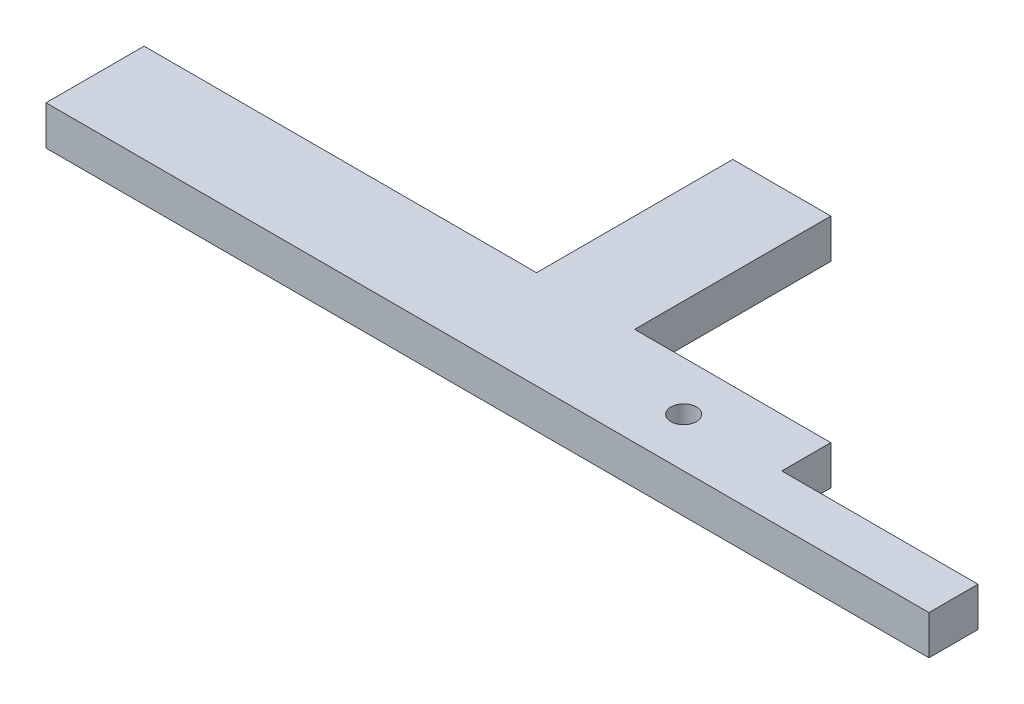
ISO-10303-21;
HEADER;
FILE_DESCRIPTION(('STEP AP214'),'2;1');
FILE_NAME('part.step','',(''),(''),'','','');
FILE_SCHEMA(('AUTOMOTIVE_DESIGN { 1 0 10303 214 1 1 1 1 }'));
ENDSEC;
DATA;
#1=APPLICATION_CONTEXT('core data for automotive mechanical design processes');
#2=APPLICATION_PROTOCOL_DEFINITION('international standard','automotive_design',2000,#1);
#3=PRODUCT_CONTEXT('',#1,'mechanical');
#4=PRODUCT('Part','Part','',(#3));
#5=PRODUCT_RELATED_PRODUCT_CATEGORY('part','',(#4));
#6=PRODUCT_DEFINITION_FORMATION('','',#4);
#7=PRODUCT_DEFINITION_CONTEXT('part definition',#1,'design');
#8=PRODUCT_DEFINITION('design','',#6,#7);
#9=PRODUCT_DEFINITION_SHAPE('','',#8);
#10=(LENGTH_UNIT() NAMED_UNIT(*) SI_UNIT(.MILLI.,.METRE.));
#11=(NAMED_UNIT(*) PLANE_ANGLE_UNIT() SI_UNIT($,.RADIAN.));
#12=(NAMED_UNIT(*) SI_UNIT($,.STERADIAN.) SOLID_ANGLE_UNIT());
#13=UNCERTAINTY_MEASURE_WITH_UNIT(LENGTH_MEASURE(1.E-05),#10,'distance_accuracy_value','');
#14=(GEOMETRIC_REPRESENTATION_CONTEXT(3) GLOBAL_UNCERTAINTY_ASSIGNED_CONTEXT((#13)) GLOBAL_UNIT_ASSIGNED_CONTEXT((#10,
#11,#12)) REPRESENTATION_CONTEXT('',''));
#15=CARTESIAN_POINT('',(0.,0.,0.));
#16=DIRECTION('',(0.,0.,1.));
#17=DIRECTION('',(1.,0.,0.));
#18=AXIS2_PLACEMENT_3D('',#15,#16,#17);
#19=CARTESIAN_POINT('',(0.,10.16,12.7));
#20=DIRECTION('',(0.,0.,-1.));
#21=DIRECTION('',(-1.,0.,0.));
#22=AXIS2_PLACEMENT_3D('',#19,#20,#21);
#23=PLANE('',#22);
#24=DIRECTION('',(1.,0.,0.));
#25=VECTOR('',#24,1.);
#26=CARTESIAN_POINT('',(0.,0.,12.7));
#27=LINE('',#26,#25);
#28=CARTESIAN_POINT('',(-152.4,0.,12.7));
#29=VERTEX_POINT('',#28);
#30=CARTESIAN_POINT('',(76.2,0.,12.7));
#31=VERTEX_POINT('',#30);
#32=EDGE_CURVE('E151',#29,#31,#27,.T.);
#33=ORIENTED_EDGE('',*,*,#32,.T.);
#34=DIRECTION('',(0.,-1.,0.));
#35=VECTOR('',#34,1.);
#36=CARTESIAN_POINT('',(76.2,10.16,12.7));
#37=LINE('',#36,#35);
#38=CARTESIAN_POINT('',(76.2,10.16,12.7));
#39=VERTEX_POINT('',#38);
#40=EDGE_CURVE('E11',#39,#31,#37,.T.);
#41=ORIENTED_EDGE('',*,*,#40,.F.);
#42=DIRECTION('',(1.,0.,0.));
#43=VECTOR('',#42,1.);
#44=CARTESIAN_POINT('',(0.,10.16,12.7));
#45=LINE('',#44,#43);
#46=CARTESIAN_POINT('',(-152.4,10.16,12.7));
#47=VERTEX_POINT('',#46);
#48=EDGE_CURVE('E211',#47,#39,#45,.T.);
#49=ORIENTED_EDGE('',*,*,#48,.F.);
#50=DIRECTION('',(0.,-1.,0.));
#51=VECTOR('',#50,1.);
#52=CARTESIAN_POINT('',(-152.4,10.16,12.7));
#53=LINE('',#52,#51);
#54=EDGE_CURVE('E144',#47,#29,#53,.T.);
#55=ORIENTED_EDGE('',*,*,#54,.T.);
#56=EDGE_LOOP('',(#33,#41,#49,#55));
#57=FACE_BOUND('',#56,.T.);
#58=ADVANCED_FACE('F41',(#57),#23,.F.);
#59=CARTESIAN_POINT('',(76.2,10.16,0.));
#60=DIRECTION('',(-1.,0.,0.));
#61=DIRECTION('',(0.,0.,1.));
#62=AXIS2_PLACEMENT_3D('',#59,#60,#61);
#63=PLANE('',#62);
#64=DIRECTION('',(0.,0.,-1.));
#65=VECTOR('',#64,1.);
#66=CARTESIAN_POINT('',(76.2,0.,0.));
#67=LINE('',#66,#65);
#68=CARTESIAN_POINT('',(76.2,0.,0.));
#69=VERTEX_POINT('',#68);
#70=EDGE_CURVE('E154',#31,#69,#67,.T.);
#71=ORIENTED_EDGE('',*,*,#70,.T.);
#72=DIRECTION('',(0.,-1.,0.));
#73=VECTOR('',#72,1.);
#74=CARTESIAN_POINT('',(76.2,10.16,0.));
#75=LINE('',#74,#73);
#76=CARTESIAN_POINT('',(76.2,10.16,0.));
#77=VERTEX_POINT('',#76);
#78=EDGE_CURVE('E50',#77,#69,#75,.T.);
#79=ORIENTED_EDGE('',*,*,#78,.F.);
#80=DIRECTION('',(0.,0.,-1.));
#81=VECTOR('',#80,1.);
#82=CARTESIAN_POINT('',(76.2,10.16,0.));
#83=LINE('',#82,#81);
#84=EDGE_CURVE('E103',#39,#77,#83,.T.);
#85=ORIENTED_EDGE('',*,*,#84,.F.);
#86=ORIENTED_EDGE('',*,*,#40,.T.);
#87=EDGE_LOOP('',(#71,#79,#85,#86));
#88=FACE_BOUND('',#87,.T.);
#89=ADVANCED_FACE('F193',(#88),#63,.F.);
#90=CARTESIAN_POINT('',(0.,10.16,0.));
#91=DIRECTION('',(0.,0.,-1.));
#92=DIRECTION('',(-1.,0.,0.));
#93=AXIS2_PLACEMENT_3D('',#90,#91,#92);
#94=PLANE('',#93);
#95=DIRECTION('',(1.,0.,0.));
#96=VECTOR('',#95,1.);
#97=CARTESIAN_POINT('',(0.,0.,0.));
#98=LINE('',#97,#96);
#99=CARTESIAN_POINT('',(25.4,0.,0.));
#100=VERTEX_POINT('',#99);
#101=EDGE_CURVE('E157',#100,#69,#98,.T.);
#102=ORIENTED_EDGE('',*,*,#101,.F.);
#103=DIRECTION('',(0.,-1.,0.));
#104=VECTOR('',#103,1.);
#105=CARTESIAN_POINT('',(25.4,10.16,0.));
#106=LINE('',#105,#104);
#107=CARTESIAN_POINT('',(25.4,10.16,0.));
#108=VERTEX_POINT('',#107);
#109=EDGE_CURVE('E186',#108,#100,#106,.T.);
#110=ORIENTED_EDGE('',*,*,#109,.F.);
#111=DIRECTION('',(1.,0.,0.));
#112=VECTOR('',#111,1.);
#113=CARTESIAN_POINT('',(0.,10.16,0.));
#114=LINE('',#113,#112);
#115=EDGE_CURVE('E192',#108,#77,#114,.T.);
#116=ORIENTED_EDGE('',*,*,#115,.T.);
#117=ORIENTED_EDGE('',*,*,#78,.T.);
#118=EDGE_LOOP('',(#102,#110,#116,#117));
#119=FACE_BOUND('',#118,.T.);
#120=ADVANCED_FACE('F190',(#119),#94,.T.);
#121=CARTESIAN_POINT('',(25.4,10.16,0.));
#122=DIRECTION('',(1.,0.,0.));
#123=DIRECTION('',(0.,0.,-1.));
#124=AXIS2_PLACEMENT_3D('',#121,#122,#123);
#125=PLANE('',#124);
#126=DIRECTION('',(0.,0.,1.));
#127=VECTOR('',#126,1.);
#128=CARTESIAN_POINT('',(25.4,0.,0.));
#129=LINE('',#128,#127);
#130=CARTESIAN_POINT('',(25.4,0.,-12.7));
#131=VERTEX_POINT('',#130);
#132=EDGE_CURVE('E160',#131,#100,#129,.T.);
#133=ORIENTED_EDGE('',*,*,#132,.F.);
#134=DIRECTION('',(0.,-1.,0.));
#135=VECTOR('',#134,1.);
#136=CARTESIAN_POINT('',(25.4,10.16,-12.7));
#137=LINE('',#136,#135);
#138=CARTESIAN_POINT('',(25.4,10.16,-12.7));
#139=VERTEX_POINT('',#138);
#140=EDGE_CURVE('E184',#139,#131,#137,.T.);
#141=ORIENTED_EDGE('',*,*,#140,.F.);
#142=DIRECTION('',(0.,0.,1.));
#143=VECTOR('',#142,1.);
#144=CARTESIAN_POINT('',(25.4,10.16,0.));
#145=LINE('',#144,#143);
#146=EDGE_CURVE('E205',#139,#108,#145,.T.);
#147=ORIENTED_EDGE('',*,*,#146,.T.);
#148=ORIENTED_EDGE('',*,*,#109,.T.);
#149=EDGE_LOOP('',(#133,#141,#147,#148));
#150=FACE_BOUND('',#149,.T.);
#151=ADVANCED_FACE('F202',(#150),#125,.T.);
#152=CARTESIAN_POINT('',(0.,10.16,-12.7));
#153=DIRECTION('',(0.,0.,-1.));
#154=DIRECTION('',(-1.,0.,0.));
#155=AXIS2_PLACEMENT_3D('',#152,#153,#154);
#156=PLANE('',#155);
#157=DIRECTION('',(1.,0.,0.));
#158=VECTOR('',#157,1.);
#159=CARTESIAN_POINT('',(0.,0.,-12.7));
#160=LINE('',#159,#158);
#161=CARTESIAN_POINT('',(-25.4,0.,-12.7));
#162=VERTEX_POINT('',#161);
#163=EDGE_CURVE('E163',#162,#131,#160,.T.);
#164=ORIENTED_EDGE('',*,*,#163,.F.);
#165=DIRECTION('',(0.,-1.,0.));
#166=VECTOR('',#165,1.);
#167=CARTESIAN_POINT('',(-25.4,10.16,-12.7));
#168=LINE('',#167,#166);
#169=CARTESIAN_POINT('',(-25.4,10.16,-12.7));
#170=VERTEX_POINT('',#169);
#171=EDGE_CURVE('E182',#170,#162,#168,.T.);
#172=ORIENTED_EDGE('',*,*,#171,.F.);
#173=DIRECTION('',(1.,0.,0.));
#174=VECTOR('',#173,1.);
#175=CARTESIAN_POINT('',(0.,10.16,-12.7));
#176=LINE('',#175,#174);
#177=EDGE_CURVE('E209',#170,#139,#176,.T.);
#178=ORIENTED_EDGE('',*,*,#177,.T.);
#179=ORIENTED_EDGE('',*,*,#140,.T.);
#180=EDGE_LOOP('',(#164,#172,#178,#179));
#181=FACE_BOUND('',#180,.T.);
#182=ADVANCED_FACE('F245',(#181),#156,.T.);
#183=CARTESIAN_POINT('',(-25.4,10.16,0.));
#184=DIRECTION('',(-1.,0.,0.));
#185=DIRECTION('',(0.,0.,1.));
#186=AXIS2_PLACEMENT_3D('',#183,#184,#185);
#187=PLANE('',#186);
#188=DIRECTION('',(0.,0.,-1.));
#189=VECTOR('',#188,1.);
#190=CARTESIAN_POINT('',(-25.4,0.,0.));
#191=LINE('',#190,#189);
#192=CARTESIAN_POINT('',(-25.4,0.,-63.5));
#193=VERTEX_POINT('',#192);
#194=EDGE_CURVE('E166',#162,#193,#191,.T.);
#195=ORIENTED_EDGE('',*,*,#194,.T.);
#196=DIRECTION('',(0.,-1.,0.));
#197=VECTOR('',#196,1.);
#198=CARTESIAN_POINT('',(-25.4,10.16,-63.5));
#199=LINE('',#198,#197);
#200=CARTESIAN_POINT('',(-25.4,10.16,-63.5));
#201=VERTEX_POINT('',#200);
#202=EDGE_CURVE('E180',#201,#193,#199,.T.);
#203=ORIENTED_EDGE('',*,*,#202,.F.);
#204=DIRECTION('',(0.,0.,-1.));
#205=VECTOR('',#204,1.);
#206=CARTESIAN_POINT('',(-25.4,10.16,0.));
#207=LINE('',#206,#205);
#208=EDGE_CURVE('E216',#170,#201,#207,.T.);
#209=ORIENTED_EDGE('',*,*,#208,.F.);
#210=ORIENTED_EDGE('',*,*,#171,.T.);
#211=EDGE_LOOP('',(#195,#203,#209,#210));
#212=FACE_BOUND('',#211,.T.);
#213=ADVANCED_FACE('F248',(#212),#187,.F.);
#214=CARTESIAN_POINT('',(0.,10.16,-63.5));
#215=DIRECTION('',(0.,0.,-1.));
#216=DIRECTION('',(-1.,0.,0.));
#217=AXIS2_PLACEMENT_3D('',#214,#215,#216);
#218=PLANE('',#217);
#219=DIRECTION('',(1.,0.,0.));
#220=VECTOR('',#219,1.);
#221=CARTESIAN_POINT('',(0.,0.,-63.5));
#222=LINE('',#221,#220);
#223=CARTESIAN_POINT('',(-50.8,0.,-63.5));
#224=VERTEX_POINT('',#223);
#225=EDGE_CURVE('E169',#224,#193,#222,.T.);
#226=ORIENTED_EDGE('',*,*,#225,.F.);
#227=DIRECTION('',(0.,-1.,0.));
#228=VECTOR('',#227,1.);
#229=CARTESIAN_POINT('',(-50.8,10.16,-63.5));
#230=LINE('',#229,#228);
#231=CARTESIAN_POINT('',(-50.8,10.16,-63.5));
#232=VERTEX_POINT('',#231);
#233=EDGE_CURVE('E134',#232,#224,#230,.T.);
#234=ORIENTED_EDGE('',*,*,#233,.F.);
#235=DIRECTION('',(1.,0.,0.));
#236=VECTOR('',#235,1.);
#237=CARTESIAN_POINT('',(0.,10.16,-63.5));
#238=LINE('',#237,#236);
#239=EDGE_CURVE('E140',#232,#201,#238,.T.);
#240=ORIENTED_EDGE('',*,*,#239,.T.);
#241=ORIENTED_EDGE('',*,*,#202,.T.);
#242=EDGE_LOOP('',(#226,#234,#240,#241));
#243=FACE_BOUND('',#242,.T.);
#244=ADVANCED_FACE('F219',(#243),#218,.T.);
#245=CARTESIAN_POINT('',(-50.8,10.16,0.));
#246=DIRECTION('',(-1.,0.,0.));
#247=DIRECTION('',(0.,0.,1.));
#248=AXIS2_PLACEMENT_3D('',#245,#246,#247);
#249=PLANE('',#248);
#250=DIRECTION('',(0.,0.,-1.));
#251=VECTOR('',#250,1.);
#252=CARTESIAN_POINT('',(-50.8,0.,0.));
#253=LINE('',#252,#251);
#254=CARTESIAN_POINT('',(-50.8,0.,-12.7));
#255=VERTEX_POINT('',#254);
#256=EDGE_CURVE('E129',#255,#224,#253,.T.);
#257=ORIENTED_EDGE('',*,*,#256,.F.);
#258=DIRECTION('',(0.,-1.,0.));
#259=VECTOR('',#258,1.);
#260=CARTESIAN_POINT('',(-50.8,10.16,-12.7));
#261=LINE('',#260,#259);
#262=CARTESIAN_POINT('',(-50.8,10.16,-12.7));
#263=VERTEX_POINT('',#262);
#264=EDGE_CURVE('E124',#263,#255,#261,.T.);
#265=ORIENTED_EDGE('',*,*,#264,.F.);
#266=DIRECTION('',(0.,0.,-1.));
#267=VECTOR('',#266,1.);
#268=CARTESIAN_POINT('',(-50.8,10.16,0.));
#269=LINE('',#268,#267);
#270=EDGE_CURVE('E127',#263,#232,#269,.T.);
#271=ORIENTED_EDGE('',*,*,#270,.T.);
#272=ORIENTED_EDGE('',*,*,#233,.T.);
#273=EDGE_LOOP('',(#257,#265,#271,#272));
#274=FACE_BOUND('',#273,.T.);
#275=ADVANCED_FACE('F126',(#274),#249,.T.);
#276=CARTESIAN_POINT('',(0.,10.16,-12.7));
#277=DIRECTION('',(0.,0.,-1.));
#278=DIRECTION('',(-1.,0.,0.));
#279=AXIS2_PLACEMENT_3D('',#276,#277,#278);
#280=PLANE('',#279);
#281=DIRECTION('',(1.,0.,0.));
#282=VECTOR('',#281,1.);
#283=CARTESIAN_POINT('',(0.,0.,-12.7));
#284=LINE('',#283,#282);
#285=CARTESIAN_POINT('',(-152.4,0.,-12.7));
#286=VERTEX_POINT('',#285);
#287=EDGE_CURVE('E173',#286,#255,#284,.T.);
#288=ORIENTED_EDGE('',*,*,#287,.F.);
#289=DIRECTION('',(0.,-1.,0.));
#290=VECTOR('',#289,1.);
#291=CARTESIAN_POINT('',(-152.4,10.16,-12.7));
#292=LINE('',#291,#290);
#293=CARTESIAN_POINT('',(-152.4,10.16,-12.7));
#294=VERTEX_POINT('',#293);
#295=EDGE_CURVE('E92',#294,#286,#292,.T.);
#296=ORIENTED_EDGE('',*,*,#295,.F.);
#297=DIRECTION('',(1.,0.,0.));
#298=VECTOR('',#297,1.);
#299=CARTESIAN_POINT('',(0.,10.16,-12.7));
#300=LINE('',#299,#298);
#301=EDGE_CURVE('E138',#294,#263,#300,.T.);
#302=ORIENTED_EDGE('',*,*,#301,.T.);
#303=ORIENTED_EDGE('',*,*,#264,.T.);
#304=EDGE_LOOP('',(#288,#296,#302,#303));
#305=FACE_BOUND('',#304,.T.);
#306=ADVANCED_FACE('F142',(#305),#280,.T.);
#307=CARTESIAN_POINT('',(0.,10.16,0.));
#308=DIRECTION('',(0.,-1.,0.));
#309=DIRECTION('',(0.,0.,-1.));
#310=AXIS2_PLACEMENT_3D('',#307,#308,#309);
#311=CYLINDRICAL_SURFACE('',#310,3.302);
#312=CARTESIAN_POINT('',(0.,10.16,0.));
#313=DIRECTION('',(0.,1.,0.));
#314=DIRECTION('',(0.,0.,1.));
#315=AXIS2_PLACEMENT_3D('',#312,#313,#314);
#316=CIRCLE('',#315,3.302);
#317=CARTESIAN_POINT('',(0.,10.16,3.302));
#318=VERTEX_POINT('',#317);
#319=EDGE_CURVE('E176',#318,#318,#316,.T.);
#320=ORIENTED_EDGE('',*,*,#319,.T.);
#321=EDGE_LOOP('',(#320));
#322=FACE_BOUND('',#321,.T.);
#323=CARTESIAN_POINT('',(0.,0.,0.));
#324=DIRECTION('',(0.,1.,0.));
#325=DIRECTION('',(0.,0.,1.));
#326=AXIS2_PLACEMENT_3D('',#323,#324,#325);
#327=CIRCLE('',#326,3.302);
#328=CARTESIAN_POINT('',(0.,0.,3.302));
#329=VERTEX_POINT('',#328);
#330=EDGE_CURVE('E148',#329,#329,#327,.T.);
#331=ORIENTED_EDGE('',*,*,#330,.F.);
#332=EDGE_LOOP('',(#331));
#333=FACE_BOUND('',#332,.T.);
#334=ADVANCED_FACE('F43',(#322,#333),#311,.F.);
#335=CARTESIAN_POINT('',(-152.4,10.16,0.));
#336=DIRECTION('',(1.,0.,0.));
#337=DIRECTION('',(0.,0.,-1.));
#338=AXIS2_PLACEMENT_3D('',#335,#336,#337);
#339=PLANE('',#338);
#340=DIRECTION('',(0.,0.,1.));
#341=VECTOR('',#340,1.);
#342=CARTESIAN_POINT('',(-152.4,0.,0.));
#343=LINE('',#342,#341);
#344=EDGE_CURVE('E95',#286,#29,#343,.T.);
#345=ORIENTED_EDGE('',*,*,#344,.T.);
#346=ORIENTED_EDGE('',*,*,#54,.F.);
#347=DIRECTION('',(0.,0.,1.));
#348=VECTOR('',#347,1.);
#349=CARTESIAN_POINT('',(-152.4,10.16,0.));
#350=LINE('',#349,#348);
#351=EDGE_CURVE('E58',#294,#47,#350,.T.);
#352=ORIENTED_EDGE('',*,*,#351,.F.);
#353=ORIENTED_EDGE('',*,*,#295,.T.);
#354=EDGE_LOOP('',(#345,#346,#352,#353));
#355=FACE_BOUND('',#354,.T.);
#356=ADVANCED_FACE('F223',(#355),#339,.F.);
#357=CARTESIAN_POINT('',(0.,10.16,0.));
#358=DIRECTION('',(0.,1.,0.));
#359=DIRECTION('',(0.,0.,1.));
#360=AXIS2_PLACEMENT_3D('',#357,#358,#359);
#361=PLANE('',#360);
#362=ORIENTED_EDGE('',*,*,#319,.F.);
#363=EDGE_LOOP('',(#362));
#364=FACE_BOUND('',#363,.T.);
#365=ORIENTED_EDGE('',*,*,#48,.T.);
#366=ORIENTED_EDGE('',*,*,#84,.T.);
#367=ORIENTED_EDGE('',*,*,#115,.F.);
#368=ORIENTED_EDGE('',*,*,#146,.F.);
#369=ORIENTED_EDGE('',*,*,#177,.F.);
#370=ORIENTED_EDGE('',*,*,#208,.T.);
#371=ORIENTED_EDGE('',*,*,#239,.F.);
#372=ORIENTED_EDGE('',*,*,#270,.F.);
#373=ORIENTED_EDGE('',*,*,#301,.F.);
#374=ORIENTED_EDGE('',*,*,#351,.T.);
#375=EDGE_LOOP('',(#365,#366,#367,#368,#369,#370,#371,#372,#373,#374));
#376=FACE_BOUND('',#375,.T.);
#377=ADVANCED_FACE('F137',(#364,#376),#361,.T.);
#378=CARTESIAN_POINT('',(0.,0.,0.));
#379=DIRECTION('',(0.,1.,0.));
#380=DIRECTION('',(0.,0.,1.));
#381=AXIS2_PLACEMENT_3D('',#378,#379,#380);
#382=PLANE('',#381);
#383=ORIENTED_EDGE('',*,*,#330,.T.);
#384=EDGE_LOOP('',(#383));
#385=FACE_BOUND('',#384,.T.);
#386=ORIENTED_EDGE('',*,*,#32,.F.);
#387=ORIENTED_EDGE('',*,*,#344,.F.);
#388=ORIENTED_EDGE('',*,*,#287,.T.);
#389=ORIENTED_EDGE('',*,*,#256,.T.);
#390=ORIENTED_EDGE('',*,*,#225,.T.);
#391=ORIENTED_EDGE('',*,*,#194,.F.);
#392=ORIENTED_EDGE('',*,*,#163,.T.);
#393=ORIENTED_EDGE('',*,*,#132,.T.);
#394=ORIENTED_EDGE('',*,*,#101,.T.);
#395=ORIENTED_EDGE('',*,*,#70,.F.);
#396=EDGE_LOOP('',(#386,#387,#388,#389,#390,#391,#392,#393,#394,#395));
#397=FACE_BOUND('',#396,.T.);
#398=ADVANCED_FACE('F197',(#385,#397),#382,.F.);
#399=CLOSED_SHELL('',(#58,#89,#120,#151,#182,#213,#244,#275,#306,#334,#356,#377,#398));
#400=MANIFOLD_SOLID_BREP('B2',#399);
#401=ADVANCED_BREP_SHAPE_REPRESENTATION('',(#18,#400),#14);
#402=SHAPE_DEFINITION_REPRESENTATION(#9,#401);
ENDSEC;
END-ISO-10303-21;
